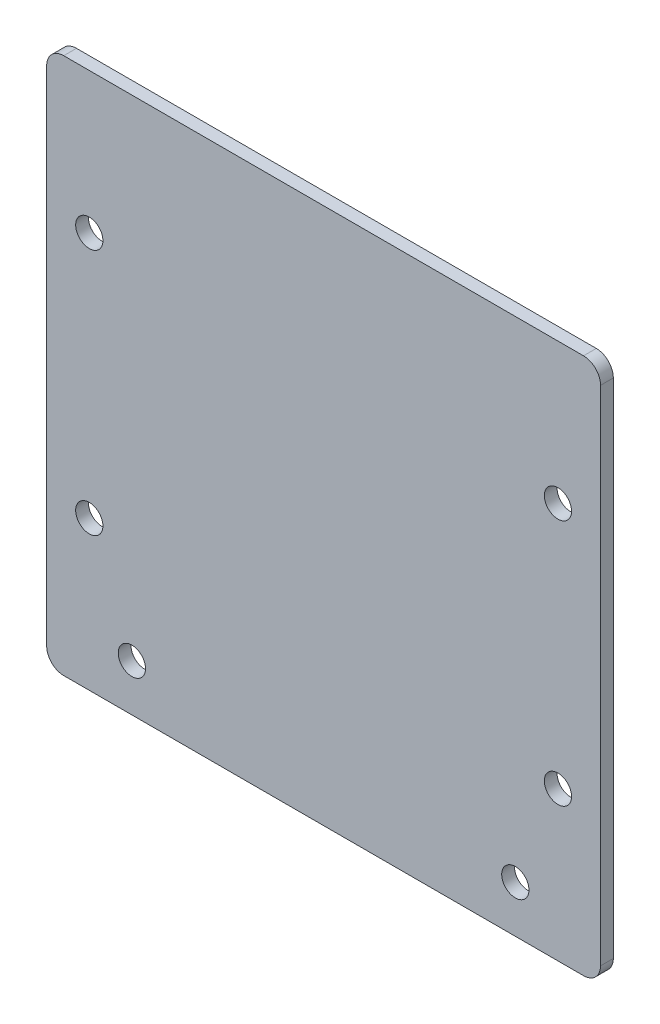
ISO-10303-21;
HEADER;
FILE_DESCRIPTION(('STEP AP214'),'2;1');
FILE_NAME('part.step','',(''),(''),'','','');
FILE_SCHEMA(('AUTOMOTIVE_DESIGN { 1 0 10303 214 1 1 1 1 }'));
ENDSEC;
DATA;
#1=APPLICATION_CONTEXT('core data for automotive mechanical design processes');
#2=APPLICATION_PROTOCOL_DEFINITION('international standard','automotive_design',2000,#1);
#3=PRODUCT_CONTEXT('',#1,'mechanical');
#4=PRODUCT('Part','Part','',(#3));
#5=PRODUCT_RELATED_PRODUCT_CATEGORY('part','',(#4));
#6=PRODUCT_DEFINITION_FORMATION('','',#4);
#7=PRODUCT_DEFINITION_CONTEXT('part definition',#1,'design');
#8=PRODUCT_DEFINITION('design','',#6,#7);
#9=PRODUCT_DEFINITION_SHAPE('','',#8);
#10=(LENGTH_UNIT() NAMED_UNIT(*) SI_UNIT(.MILLI.,.METRE.));
#11=(NAMED_UNIT(*) PLANE_ANGLE_UNIT() SI_UNIT($,.RADIAN.));
#12=(NAMED_UNIT(*) SI_UNIT($,.STERADIAN.) SOLID_ANGLE_UNIT());
#13=UNCERTAINTY_MEASURE_WITH_UNIT(LENGTH_MEASURE(1.E-05),#10,'distance_accuracy_value','');
#14=(GEOMETRIC_REPRESENTATION_CONTEXT(3) GLOBAL_UNCERTAINTY_ASSIGNED_CONTEXT((#13)) GLOBAL_UNIT_ASSIGNED_CONTEXT((#10,
#11,#12)) REPRESENTATION_CONTEXT('',''));
#15=CARTESIAN_POINT('',(0.,0.,0.));
#16=DIRECTION('',(0.,0.,1.));
#17=DIRECTION('',(1.,0.,0.));
#18=AXIS2_PLACEMENT_3D('',#15,#16,#17);
#19=CARTESIAN_POINT('',(0.,0.,1.5));
#20=DIRECTION('',(0.,0.,-1.));
#21=DIRECTION('',(-1.,0.,0.));
#22=AXIS2_PLACEMENT_3D('',#19,#20,#21);
#23=PLANE('',#22);
#24=DIRECTION('',(-1.,0.,0.));
#25=VECTOR('',#24,1.);
#26=CARTESIAN_POINT('',(-32.5,31.5,1.5));
#27=LINE('',#26,#25);
#28=CARTESIAN_POINT('',(30.5,31.5,1.5));
#29=VERTEX_POINT('',#28);
#30=CARTESIAN_POINT('',(-30.5,31.5,1.5));
#31=VERTEX_POINT('',#30);
#32=EDGE_CURVE('E171',#29,#31,#27,.T.);
#33=ORIENTED_EDGE('',*,*,#32,.T.);
#34=CARTESIAN_POINT('',(-30.5,29.5,1.5));
#35=DIRECTION('',(0.,0.,-1.));
#36=DIRECTION('',(-1.,0.,0.));
#37=AXIS2_PLACEMENT_3D('',#34,#35,#36);
#38=CIRCLE('',#37,2.);
#39=CARTESIAN_POINT('',(-32.5,29.5,1.5));
#40=VERTEX_POINT('',#39);
#41=EDGE_CURVE('E149',#31,#40,#38,.F.);
#42=ORIENTED_EDGE('',*,*,#41,.T.);
#43=DIRECTION('',(0.,-1.,0.));
#44=VECTOR('',#43,1.);
#45=CARTESIAN_POINT('',(-32.5,-31.5,1.5));
#46=LINE('',#45,#44);
#47=CARTESIAN_POINT('',(-32.5,-29.5,1.5));
#48=VERTEX_POINT('',#47);
#49=EDGE_CURVE('E119',#40,#48,#46,.T.);
#50=ORIENTED_EDGE('',*,*,#49,.T.);
#51=CARTESIAN_POINT('',(-30.5,-29.5,1.5));
#52=DIRECTION('',(0.,0.,-1.));
#53=DIRECTION('',(-1.,0.,0.));
#54=AXIS2_PLACEMENT_3D('',#51,#52,#53);
#55=CIRCLE('',#54,2.);
#56=CARTESIAN_POINT('',(-30.5,-31.5,1.5));
#57=VERTEX_POINT('',#56);
#58=EDGE_CURVE('E55',#48,#57,#55,.F.);
#59=ORIENTED_EDGE('',*,*,#58,.T.);
#60=DIRECTION('',(1.,0.,0.));
#61=VECTOR('',#60,1.);
#62=CARTESIAN_POINT('',(-32.5,-31.5,1.5));
#63=LINE('',#62,#61);
#64=CARTESIAN_POINT('',(30.5,-31.5,1.5));
#65=VERTEX_POINT('',#64);
#66=EDGE_CURVE('E136',#57,#65,#63,.T.);
#67=ORIENTED_EDGE('',*,*,#66,.T.);
#68=CARTESIAN_POINT('',(30.5,-29.5,1.5));
#69=DIRECTION('',(0.,0.,-1.));
#70=DIRECTION('',(-1.,0.,0.));
#71=AXIS2_PLACEMENT_3D('',#68,#69,#70);
#72=CIRCLE('',#71,2.);
#73=CARTESIAN_POINT('',(32.5,-29.5,1.5));
#74=VERTEX_POINT('',#73);
#75=EDGE_CURVE('E147',#65,#74,#72,.F.);
#76=ORIENTED_EDGE('',*,*,#75,.T.);
#77=DIRECTION('',(0.,1.,0.));
#78=VECTOR('',#77,1.);
#79=CARTESIAN_POINT('',(32.5,-31.5,1.5));
#80=LINE('',#79,#78);
#81=CARTESIAN_POINT('',(32.5,29.5,1.5));
#82=VERTEX_POINT('',#81);
#83=EDGE_CURVE('E130',#74,#82,#80,.T.);
#84=ORIENTED_EDGE('',*,*,#83,.T.);
#85=CARTESIAN_POINT('',(30.5,29.5,1.5));
#86=DIRECTION('',(0.,0.,-1.));
#87=DIRECTION('',(-1.,0.,0.));
#88=AXIS2_PLACEMENT_3D('',#85,#86,#87);
#89=CIRCLE('',#88,2.);
#90=EDGE_CURVE('E144',#82,#29,#89,.F.);
#91=ORIENTED_EDGE('',*,*,#90,.T.);
#92=EDGE_LOOP('',(#33,#42,#50,#59,#67,#76,#84,#91));
#93=FACE_BOUND('',#92,.T.);
#94=CARTESIAN_POINT('',(-27.5,-14.,1.5));
#95=DIRECTION('',(0.,0.,1.));
#96=DIRECTION('',(1.,0.,0.));
#97=AXIS2_PLACEMENT_3D('',#94,#95,#96);
#98=CIRCLE('',#97,1.6);
#99=CARTESIAN_POINT('',(-25.9,-14.,1.5));
#100=VERTEX_POINT('',#99);
#101=EDGE_CURVE('E180',#100,#100,#98,.T.);
#102=ORIENTED_EDGE('',*,*,#101,.F.);
#103=EDGE_LOOP('',(#102));
#104=FACE_BOUND('',#103,.T.);
#105=CARTESIAN_POINT('',(-27.5,15.,1.5));
#106=DIRECTION('',(0.,0.,1.));
#107=DIRECTION('',(1.,0.,0.));
#108=AXIS2_PLACEMENT_3D('',#105,#106,#107);
#109=CIRCLE('',#108,1.6);
#110=CARTESIAN_POINT('',(-25.9,15.,1.5));
#111=VERTEX_POINT('',#110);
#112=EDGE_CURVE('E185',#111,#111,#109,.T.);
#113=ORIENTED_EDGE('',*,*,#112,.F.);
#114=EDGE_LOOP('',(#113));
#115=FACE_BOUND('',#114,.T.);
#116=CARTESIAN_POINT('',(27.5,15.,1.5));
#117=DIRECTION('',(0.,0.,1.));
#118=DIRECTION('',(1.,0.,0.));
#119=AXIS2_PLACEMENT_3D('',#116,#117,#118);
#120=CIRCLE('',#119,1.6);
#121=CARTESIAN_POINT('',(29.1,15.,1.5));
#122=VERTEX_POINT('',#121);
#123=EDGE_CURVE('E190',#122,#122,#120,.T.);
#124=ORIENTED_EDGE('',*,*,#123,.F.);
#125=EDGE_LOOP('',(#124));
#126=FACE_BOUND('',#125,.T.);
#127=CARTESIAN_POINT('',(27.5,-14.,1.5));
#128=DIRECTION('',(0.,0.,1.));
#129=DIRECTION('',(1.,0.,0.));
#130=AXIS2_PLACEMENT_3D('',#127,#128,#129);
#131=CIRCLE('',#130,1.6);
#132=CARTESIAN_POINT('',(29.1,-14.,1.5));
#133=VERTEX_POINT('',#132);
#134=EDGE_CURVE('E196',#133,#133,#131,.T.);
#135=ORIENTED_EDGE('',*,*,#134,.F.);
#136=EDGE_LOOP('',(#135));
#137=FACE_BOUND('',#136,.T.);
#138=CARTESIAN_POINT('',(22.5,-26.,1.5));
#139=DIRECTION('',(0.,0.,1.));
#140=DIRECTION('',(1.,0.,0.));
#141=AXIS2_PLACEMENT_3D('',#138,#139,#140);
#142=CIRCLE('',#141,1.6);
#143=CARTESIAN_POINT('',(24.1,-26.,1.5));
#144=VERTEX_POINT('',#143);
#145=EDGE_CURVE('E202',#144,#144,#142,.T.);
#146=ORIENTED_EDGE('',*,*,#145,.F.);
#147=EDGE_LOOP('',(#146));
#148=FACE_BOUND('',#147,.T.);
#149=CARTESIAN_POINT('',(-22.5,-26.,1.5));
#150=DIRECTION('',(0.,0.,1.));
#151=DIRECTION('',(1.,0.,0.));
#152=AXIS2_PLACEMENT_3D('',#149,#150,#151);
#153=CIRCLE('',#152,1.6);
#154=CARTESIAN_POINT('',(-20.9,-26.,1.5));
#155=VERTEX_POINT('',#154);
#156=EDGE_CURVE('E208',#155,#155,#153,.T.);
#157=ORIENTED_EDGE('',*,*,#156,.F.);
#158=EDGE_LOOP('',(#157));
#159=FACE_BOUND('',#158,.T.);
#160=ADVANCED_FACE('F35',(#93,#104,#115,#126,#137,#148,#159),#23,.F.);
#161=CARTESIAN_POINT('',(0.,0.,0.));
#162=DIRECTION('',(0.,0.,-1.));
#163=DIRECTION('',(-1.,0.,0.));
#164=AXIS2_PLACEMENT_3D('',#161,#162,#163);
#165=PLANE('',#164);
#166=CARTESIAN_POINT('',(22.5,-26.,0.));
#167=DIRECTION('',(0.,0.,1.));
#168=DIRECTION('',(1.,0.,0.));
#169=AXIS2_PLACEMENT_3D('',#166,#167,#168);
#170=CIRCLE('',#169,1.6);
#171=CARTESIAN_POINT('',(24.1,-26.,0.));
#172=VERTEX_POINT('',#171);
#173=EDGE_CURVE('E205',#172,#172,#170,.T.);
#174=ORIENTED_EDGE('',*,*,#173,.T.);
#175=EDGE_LOOP('',(#174));
#176=FACE_BOUND('',#175,.T.);
#177=CARTESIAN_POINT('',(27.5,15.,0.));
#178=DIRECTION('',(0.,0.,1.));
#179=DIRECTION('',(1.,0.,0.));
#180=AXIS2_PLACEMENT_3D('',#177,#178,#179);
#181=CIRCLE('',#180,1.6);
#182=CARTESIAN_POINT('',(29.1,15.,0.));
#183=VERTEX_POINT('',#182);
#184=EDGE_CURVE('E193',#183,#183,#181,.T.);
#185=ORIENTED_EDGE('',*,*,#184,.T.);
#186=EDGE_LOOP('',(#185));
#187=FACE_BOUND('',#186,.T.);
#188=CARTESIAN_POINT('',(-27.5,-14.,0.));
#189=DIRECTION('',(0.,0.,1.));
#190=DIRECTION('',(1.,0.,0.));
#191=AXIS2_PLACEMENT_3D('',#188,#189,#190);
#192=CIRCLE('',#191,1.6);
#193=CARTESIAN_POINT('',(-25.9,-14.,0.));
#194=VERTEX_POINT('',#193);
#195=EDGE_CURVE('E176',#194,#194,#192,.T.);
#196=ORIENTED_EDGE('',*,*,#195,.T.);
#197=EDGE_LOOP('',(#196));
#198=FACE_BOUND('',#197,.T.);
#199=DIRECTION('',(0.,-1.,0.));
#200=VECTOR('',#199,1.);
#201=CARTESIAN_POINT('',(-32.5,-31.5,0.));
#202=LINE('',#201,#200);
#203=CARTESIAN_POINT('',(-32.5,29.5,0.));
#204=VERTEX_POINT('',#203);
#205=CARTESIAN_POINT('',(-32.5,-29.5,0.));
#206=VERTEX_POINT('',#205);
#207=EDGE_CURVE('E117',#204,#206,#202,.T.);
#208=ORIENTED_EDGE('',*,*,#207,.F.);
#209=CARTESIAN_POINT('',(-30.5,29.5,0.));
#210=DIRECTION('',(0.,0.,-1.));
#211=DIRECTION('',(-1.,0.,0.));
#212=AXIS2_PLACEMENT_3D('',#209,#210,#211);
#213=CIRCLE('',#212,2.);
#214=CARTESIAN_POINT('',(-30.5,31.5,0.));
#215=VERTEX_POINT('',#214);
#216=EDGE_CURVE('E100',#204,#215,#213,.T.);
#217=ORIENTED_EDGE('',*,*,#216,.T.);
#218=DIRECTION('',(-1.,0.,0.));
#219=VECTOR('',#218,1.);
#220=CARTESIAN_POINT('',(-32.5,31.5,0.));
#221=LINE('',#220,#219);
#222=CARTESIAN_POINT('',(30.5,31.5,0.));
#223=VERTEX_POINT('',#222);
#224=EDGE_CURVE('E128',#223,#215,#221,.T.);
#225=ORIENTED_EDGE('',*,*,#224,.F.);
#226=CARTESIAN_POINT('',(30.5,29.5,0.));
#227=DIRECTION('',(0.,0.,-1.));
#228=DIRECTION('',(-1.,0.,0.));
#229=AXIS2_PLACEMENT_3D('',#226,#227,#228);
#230=CIRCLE('',#229,2.);
#231=CARTESIAN_POINT('',(32.5,29.5,0.));
#232=VERTEX_POINT('',#231);
#233=EDGE_CURVE('E120',#223,#232,#230,.T.);
#234=ORIENTED_EDGE('',*,*,#233,.T.);
#235=DIRECTION('',(0.,1.,0.));
#236=VECTOR('',#235,1.);
#237=CARTESIAN_POINT('',(32.5,-31.5,0.));
#238=LINE('',#237,#236);
#239=CARTESIAN_POINT('',(32.5,-29.5,0.));
#240=VERTEX_POINT('',#239);
#241=EDGE_CURVE('E132',#240,#232,#238,.T.);
#242=ORIENTED_EDGE('',*,*,#241,.F.);
#243=CARTESIAN_POINT('',(30.5,-29.5,0.));
#244=DIRECTION('',(0.,0.,-1.));
#245=DIRECTION('',(-1.,0.,0.));
#246=AXIS2_PLACEMENT_3D('',#243,#244,#245);
#247=CIRCLE('',#246,2.);
#248=CARTESIAN_POINT('',(30.5,-31.5,0.));
#249=VERTEX_POINT('',#248);
#250=EDGE_CURVE('E111',#240,#249,#247,.T.);
#251=ORIENTED_EDGE('',*,*,#250,.T.);
#252=DIRECTION('',(1.,0.,0.));
#253=VECTOR('',#252,1.);
#254=CARTESIAN_POINT('',(-32.5,-31.5,0.));
#255=LINE('',#254,#253);
#256=CARTESIAN_POINT('',(-30.5,-31.5,0.));
#257=VERTEX_POINT('',#256);
#258=EDGE_CURVE('E127',#257,#249,#255,.T.);
#259=ORIENTED_EDGE('',*,*,#258,.F.);
#260=CARTESIAN_POINT('',(-30.5,-29.5,0.));
#261=DIRECTION('',(0.,0.,-1.));
#262=DIRECTION('',(-1.,0.,0.));
#263=AXIS2_PLACEMENT_3D('',#260,#261,#262);
#264=CIRCLE('',#263,2.);
#265=EDGE_CURVE('E126',#257,#206,#264,.T.);
#266=ORIENTED_EDGE('',*,*,#265,.T.);
#267=EDGE_LOOP('',(#208,#217,#225,#234,#242,#251,#259,#266));
#268=FACE_BOUND('',#267,.T.);
#269=CARTESIAN_POINT('',(-27.5,15.,0.));
#270=DIRECTION('',(0.,0.,1.));
#271=DIRECTION('',(1.,0.,0.));
#272=AXIS2_PLACEMENT_3D('',#269,#270,#271);
#273=CIRCLE('',#272,1.6);
#274=CARTESIAN_POINT('',(-25.9,15.,0.));
#275=VERTEX_POINT('',#274);
#276=EDGE_CURVE('E187',#275,#275,#273,.T.);
#277=ORIENTED_EDGE('',*,*,#276,.T.);
#278=EDGE_LOOP('',(#277));
#279=FACE_BOUND('',#278,.T.);
#280=CARTESIAN_POINT('',(27.5,-14.,0.));
#281=DIRECTION('',(0.,0.,1.));
#282=DIRECTION('',(1.,0.,0.));
#283=AXIS2_PLACEMENT_3D('',#280,#281,#282);
#284=CIRCLE('',#283,1.6);
#285=CARTESIAN_POINT('',(29.1,-14.,0.));
#286=VERTEX_POINT('',#285);
#287=EDGE_CURVE('E199',#286,#286,#284,.T.);
#288=ORIENTED_EDGE('',*,*,#287,.T.);
#289=EDGE_LOOP('',(#288));
#290=FACE_BOUND('',#289,.T.);
#291=CARTESIAN_POINT('',(-22.5,-26.,0.));
#292=DIRECTION('',(0.,0.,1.));
#293=DIRECTION('',(1.,0.,0.));
#294=AXIS2_PLACEMENT_3D('',#291,#292,#293);
#295=CIRCLE('',#294,1.6);
#296=CARTESIAN_POINT('',(-20.9,-26.,0.));
#297=VERTEX_POINT('',#296);
#298=EDGE_CURVE('E211',#297,#297,#295,.T.);
#299=ORIENTED_EDGE('',*,*,#298,.T.);
#300=EDGE_LOOP('',(#299));
#301=FACE_BOUND('',#300,.T.);
#302=ADVANCED_FACE('F123',(#176,#187,#198,#268,#279,#290,#301),#165,.T.);
#303=CARTESIAN_POINT('',(32.5,-31.5,1.5));
#304=DIRECTION('',(-1.,0.,0.));
#305=DIRECTION('',(0.,0.,1.));
#306=AXIS2_PLACEMENT_3D('',#303,#304,#305);
#307=PLANE('',#306);
#308=ORIENTED_EDGE('',*,*,#83,.F.);
#309=DIRECTION('',(0.,0.,-1.));
#310=VECTOR('',#309,1.);
#311=CARTESIAN_POINT('',(32.5,-29.5,1.5));
#312=LINE('',#311,#310);
#313=EDGE_CURVE('E153',#74,#240,#312,.T.);
#314=ORIENTED_EDGE('',*,*,#313,.T.);
#315=ORIENTED_EDGE('',*,*,#241,.T.);
#316=DIRECTION('',(0.,0.,-1.));
#317=VECTOR('',#316,1.);
#318=CARTESIAN_POINT('',(32.5,29.5,1.5));
#319=LINE('',#318,#317);
#320=EDGE_CURVE('E151',#232,#82,#319,.F.);
#321=ORIENTED_EDGE('',*,*,#320,.T.);
#322=EDGE_LOOP('',(#308,#314,#315,#321));
#323=FACE_BOUND('',#322,.T.);
#324=ADVANCED_FACE('F167',(#323),#307,.F.);
#325=CARTESIAN_POINT('',(-32.5,31.5,1.5));
#326=DIRECTION('',(0.,-1.,0.));
#327=DIRECTION('',(0.,0.,-1.));
#328=AXIS2_PLACEMENT_3D('',#325,#326,#327);
#329=PLANE('',#328);
#330=ORIENTED_EDGE('',*,*,#224,.T.);
#331=DIRECTION('',(0.,0.,-1.));
#332=VECTOR('',#331,1.);
#333=CARTESIAN_POINT('',(-30.5,31.5,1.5));
#334=LINE('',#333,#332);
#335=EDGE_CURVE('E105',#215,#31,#334,.F.);
#336=ORIENTED_EDGE('',*,*,#335,.T.);
#337=ORIENTED_EDGE('',*,*,#32,.F.);
#338=DIRECTION('',(0.,0.,-1.));
#339=VECTOR('',#338,1.);
#340=CARTESIAN_POINT('',(30.5,31.5,1.5));
#341=LINE('',#340,#339);
#342=EDGE_CURVE('E110',#29,#223,#341,.T.);
#343=ORIENTED_EDGE('',*,*,#342,.T.);
#344=EDGE_LOOP('',(#330,#336,#337,#343));
#345=FACE_BOUND('',#344,.T.);
#346=ADVANCED_FACE('F236',(#345),#329,.F.);
#347=CARTESIAN_POINT('',(-32.5,-31.5,1.5));
#348=DIRECTION('',(1.,0.,0.));
#349=DIRECTION('',(0.,0.,-1.));
#350=AXIS2_PLACEMENT_3D('',#347,#348,#349);
#351=PLANE('',#350);
#352=ORIENTED_EDGE('',*,*,#49,.F.);
#353=DIRECTION('',(0.,0.,-1.));
#354=VECTOR('',#353,1.);
#355=CARTESIAN_POINT('',(-32.5,29.5,1.5));
#356=LINE('',#355,#354);
#357=EDGE_CURVE('E104',#40,#204,#356,.T.);
#358=ORIENTED_EDGE('',*,*,#357,.T.);
#359=ORIENTED_EDGE('',*,*,#207,.T.);
#360=DIRECTION('',(0.,0.,-1.));
#361=VECTOR('',#360,1.);
#362=CARTESIAN_POINT('',(-32.5,-29.5,1.5));
#363=LINE('',#362,#361);
#364=EDGE_CURVE('E121',#206,#48,#363,.F.);
#365=ORIENTED_EDGE('',*,*,#364,.T.);
#366=EDGE_LOOP('',(#352,#358,#359,#365));
#367=FACE_BOUND('',#366,.T.);
#368=ADVANCED_FACE('F116',(#367),#351,.F.);
#369=CARTESIAN_POINT('',(-32.5,-31.5,1.5));
#370=DIRECTION('',(0.,1.,0.));
#371=DIRECTION('',(0.,0.,1.));
#372=AXIS2_PLACEMENT_3D('',#369,#370,#371);
#373=PLANE('',#372);
#374=ORIENTED_EDGE('',*,*,#258,.T.);
#375=DIRECTION('',(0.,0.,-1.));
#376=VECTOR('',#375,1.);
#377=CARTESIAN_POINT('',(30.5,-31.5,1.5));
#378=LINE('',#377,#376);
#379=EDGE_CURVE('E11',#249,#65,#378,.F.);
#380=ORIENTED_EDGE('',*,*,#379,.T.);
#381=ORIENTED_EDGE('',*,*,#66,.F.);
#382=DIRECTION('',(0.,0.,-1.));
#383=VECTOR('',#382,1.);
#384=CARTESIAN_POINT('',(-30.5,-31.5,1.5));
#385=LINE('',#384,#383);
#386=EDGE_CURVE('E43',#57,#257,#385,.T.);
#387=ORIENTED_EDGE('',*,*,#386,.T.);
#388=EDGE_LOOP('',(#374,#380,#381,#387));
#389=FACE_BOUND('',#388,.T.);
#390=ADVANCED_FACE('F157',(#389),#373,.F.);
#391=CARTESIAN_POINT('',(-27.5,-14.,1.5));
#392=DIRECTION('',(0.,0.,-1.));
#393=DIRECTION('',(-1.,0.,0.));
#394=AXIS2_PLACEMENT_3D('',#391,#392,#393);
#395=CYLINDRICAL_SURFACE('',#394,1.6);
#396=ORIENTED_EDGE('',*,*,#101,.T.);
#397=EDGE_LOOP('',(#396));
#398=FACE_BOUND('',#397,.T.);
#399=ORIENTED_EDGE('',*,*,#195,.F.);
#400=EDGE_LOOP('',(#399));
#401=FACE_BOUND('',#400,.T.);
#402=ADVANCED_FACE('F229',(#398,#401),#395,.F.);
#403=CARTESIAN_POINT('',(-27.5,15.,1.5));
#404=DIRECTION('',(0.,0.,-1.));
#405=DIRECTION('',(-1.,0.,0.));
#406=AXIS2_PLACEMENT_3D('',#403,#404,#405);
#407=CYLINDRICAL_SURFACE('',#406,1.6);
#408=ORIENTED_EDGE('',*,*,#112,.T.);
#409=EDGE_LOOP('',(#408));
#410=FACE_BOUND('',#409,.T.);
#411=ORIENTED_EDGE('',*,*,#276,.F.);
#412=EDGE_LOOP('',(#411));
#413=FACE_BOUND('',#412,.T.);
#414=ADVANCED_FACE('F345',(#410,#413),#407,.F.);
#415=CARTESIAN_POINT('',(27.5,15.,1.5));
#416=DIRECTION('',(0.,0.,-1.));
#417=DIRECTION('',(-1.,0.,0.));
#418=AXIS2_PLACEMENT_3D('',#415,#416,#417);
#419=CYLINDRICAL_SURFACE('',#418,1.6);
#420=ORIENTED_EDGE('',*,*,#123,.T.);
#421=EDGE_LOOP('',(#420));
#422=FACE_BOUND('',#421,.T.);
#423=ORIENTED_EDGE('',*,*,#184,.F.);
#424=EDGE_LOOP('',(#423));
#425=FACE_BOUND('',#424,.T.);
#426=ADVANCED_FACE('F335',(#422,#425),#419,.F.);
#427=CARTESIAN_POINT('',(27.5,-14.,1.5));
#428=DIRECTION('',(0.,0.,-1.));
#429=DIRECTION('',(-1.,0.,0.));
#430=AXIS2_PLACEMENT_3D('',#427,#428,#429);
#431=CYLINDRICAL_SURFACE('',#430,1.6);
#432=ORIENTED_EDGE('',*,*,#134,.T.);
#433=EDGE_LOOP('',(#432));
#434=FACE_BOUND('',#433,.T.);
#435=ORIENTED_EDGE('',*,*,#287,.F.);
#436=EDGE_LOOP('',(#435));
#437=FACE_BOUND('',#436,.T.);
#438=ADVANCED_FACE('F325',(#434,#437),#431,.F.);
#439=CARTESIAN_POINT('',(22.5,-26.,1.5));
#440=DIRECTION('',(0.,0.,-1.));
#441=DIRECTION('',(-1.,0.,0.));
#442=AXIS2_PLACEMENT_3D('',#439,#440,#441);
#443=CYLINDRICAL_SURFACE('',#442,1.6);
#444=ORIENTED_EDGE('',*,*,#145,.T.);
#445=EDGE_LOOP('',(#444));
#446=FACE_BOUND('',#445,.T.);
#447=ORIENTED_EDGE('',*,*,#173,.F.);
#448=EDGE_LOOP('',(#447));
#449=FACE_BOUND('',#448,.T.);
#450=ADVANCED_FACE('F316',(#446,#449),#443,.F.);
#451=CARTESIAN_POINT('',(-22.5,-26.,1.5));
#452=DIRECTION('',(0.,0.,-1.));
#453=DIRECTION('',(-1.,0.,0.));
#454=AXIS2_PLACEMENT_3D('',#451,#452,#453);
#455=CYLINDRICAL_SURFACE('',#454,1.6);
#456=ORIENTED_EDGE('',*,*,#156,.T.);
#457=EDGE_LOOP('',(#456));
#458=FACE_BOUND('',#457,.T.);
#459=ORIENTED_EDGE('',*,*,#298,.F.);
#460=EDGE_LOOP('',(#459));
#461=FACE_BOUND('',#460,.T.);
#462=ADVANCED_FACE('F217',(#458,#461),#455,.F.);
#463=CARTESIAN_POINT('',(-30.5,29.5,1.5));
#464=DIRECTION('',(0.,0.,-1.));
#465=DIRECTION('',(-1.,0.,0.));
#466=AXIS2_PLACEMENT_3D('',#463,#464,#465);
#467=CYLINDRICAL_SURFACE('',#466,2.);
#468=ORIENTED_EDGE('',*,*,#41,.F.);
#469=ORIENTED_EDGE('',*,*,#335,.F.);
#470=ORIENTED_EDGE('',*,*,#216,.F.);
#471=ORIENTED_EDGE('',*,*,#357,.F.);
#472=EDGE_LOOP('',(#468,#469,#470,#471));
#473=FACE_BOUND('',#472,.T.);
#474=ADVANCED_FACE('F103',(#473),#467,.T.);
#475=CARTESIAN_POINT('',(30.5,-29.5,1.5));
#476=DIRECTION('',(0.,0.,-1.));
#477=DIRECTION('',(-1.,0.,0.));
#478=AXIS2_PLACEMENT_3D('',#475,#476,#477);
#479=CYLINDRICAL_SURFACE('',#478,2.);
#480=ORIENTED_EDGE('',*,*,#75,.F.);
#481=ORIENTED_EDGE('',*,*,#379,.F.);
#482=ORIENTED_EDGE('',*,*,#250,.F.);
#483=ORIENTED_EDGE('',*,*,#313,.F.);
#484=EDGE_LOOP('',(#480,#481,#482,#483));
#485=FACE_BOUND('',#484,.T.);
#486=ADVANCED_FACE('F164',(#485),#479,.T.);
#487=CARTESIAN_POINT('',(-30.5,-29.5,1.5));
#488=DIRECTION('',(0.,0.,-1.));
#489=DIRECTION('',(-1.,0.,0.));
#490=AXIS2_PLACEMENT_3D('',#487,#488,#489);
#491=CYLINDRICAL_SURFACE('',#490,2.);
#492=ORIENTED_EDGE('',*,*,#58,.F.);
#493=ORIENTED_EDGE('',*,*,#364,.F.);
#494=ORIENTED_EDGE('',*,*,#265,.F.);
#495=ORIENTED_EDGE('',*,*,#386,.F.);
#496=EDGE_LOOP('',(#492,#493,#494,#495));
#497=FACE_BOUND('',#496,.T.);
#498=ADVANCED_FACE('F245',(#497),#491,.T.);
#499=CARTESIAN_POINT('',(30.5,29.5,1.5));
#500=DIRECTION('',(0.,0.,-1.));
#501=DIRECTION('',(-1.,0.,0.));
#502=AXIS2_PLACEMENT_3D('',#499,#500,#501);
#503=CYLINDRICAL_SURFACE('',#502,2.);
#504=ORIENTED_EDGE('',*,*,#90,.F.);
#505=ORIENTED_EDGE('',*,*,#320,.F.);
#506=ORIENTED_EDGE('',*,*,#233,.F.);
#507=ORIENTED_EDGE('',*,*,#342,.F.);
#508=EDGE_LOOP('',(#504,#505,#506,#507));
#509=FACE_BOUND('',#508,.T.);
#510=ADVANCED_FACE('F37',(#509),#503,.T.);
#511=CLOSED_SHELL('',(#160,#302,#324,#346,#368,#390,#402,#414,#426,#438,#450,#462,#474,#486,
#498,#510));
#512=MANIFOLD_SOLID_BREP('B2',#511);
#513=ADVANCED_BREP_SHAPE_REPRESENTATION('',(#18,#512),#14);
#514=SHAPE_DEFINITION_REPRESENTATION(#9,#513);
ENDSEC;
END-ISO-10303-21;
